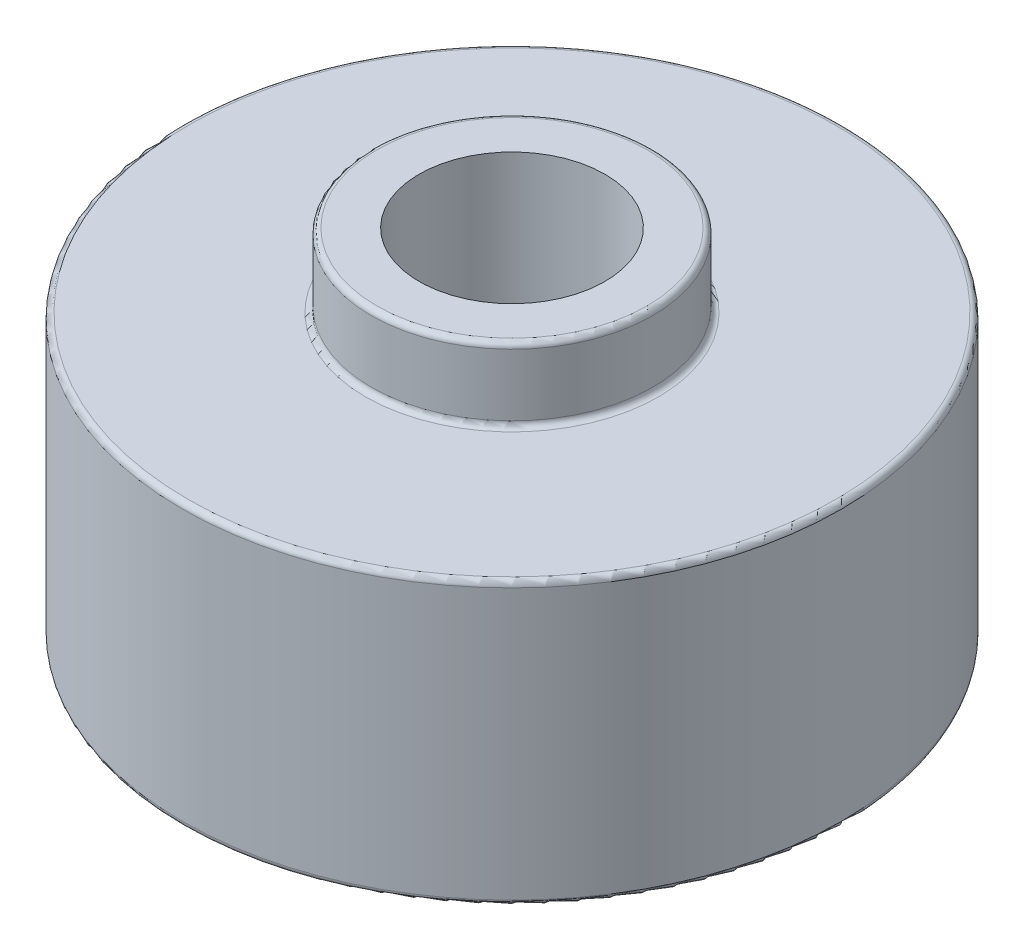
ISO-10303-21;
HEADER;
FILE_DESCRIPTION(('STEP AP214'),'2;1');
FILE_NAME('part.step','',(''),(''),'','','');
FILE_SCHEMA(('AUTOMOTIVE_DESIGN { 1 0 10303 214 1 1 1 1 }'));
ENDSEC;
DATA;
#1=APPLICATION_CONTEXT('core data for automotive mechanical design processes');
#2=APPLICATION_PROTOCOL_DEFINITION('international standard','automotive_design',2000,#1);
#3=PRODUCT_CONTEXT('',#1,'mechanical');
#4=PRODUCT('Part','Part','',(#3));
#5=PRODUCT_RELATED_PRODUCT_CATEGORY('part','',(#4));
#6=PRODUCT_DEFINITION_FORMATION('','',#4);
#7=PRODUCT_DEFINITION_CONTEXT('part definition',#1,'design');
#8=PRODUCT_DEFINITION('design','',#6,#7);
#9=PRODUCT_DEFINITION_SHAPE('','',#8);
#10=(LENGTH_UNIT() NAMED_UNIT(*) SI_UNIT(.MILLI.,.METRE.));
#11=(NAMED_UNIT(*) PLANE_ANGLE_UNIT() SI_UNIT($,.RADIAN.));
#12=(NAMED_UNIT(*) SI_UNIT($,.STERADIAN.) SOLID_ANGLE_UNIT());
#13=UNCERTAINTY_MEASURE_WITH_UNIT(LENGTH_MEASURE(1.E-05),#10,'distance_accuracy_value','');
#14=(GEOMETRIC_REPRESENTATION_CONTEXT(3) GLOBAL_UNCERTAINTY_ASSIGNED_CONTEXT((#13)) GLOBAL_UNIT_ASSIGNED_CONTEXT((#10,
#11,#12)) REPRESENTATION_CONTEXT('',''));
#15=CARTESIAN_POINT('',(0.,0.,0.));
#16=DIRECTION('',(0.,0.,1.));
#17=DIRECTION('',(1.,0.,0.));
#18=AXIS2_PLACEMENT_3D('',#15,#16,#17);
#19=CARTESIAN_POINT('',(6.35,0.,0.));
#20=DIRECTION('',(0.,-1.,0.));
#21=DIRECTION('',(0.,0.,-1.));
#22=AXIS2_PLACEMENT_3D('',#19,#20,#21);
#23=CYLINDRICAL_SURFACE('',#22,4.191);
#24=CARTESIAN_POINT('',(6.35,0.,0.));
#25=DIRECTION('',(0.,-1.,0.));
#26=DIRECTION('',(0.,0.,-1.));
#27=AXIS2_PLACEMENT_3D('',#24,#25,#26);
#28=CIRCLE('',#27,4.191);
#29=CARTESIAN_POINT('',(6.35,0.,-4.191));
#30=VERTEX_POINT('',#29);
#31=EDGE_CURVE('E68',#30,#30,#28,.T.);
#32=ORIENTED_EDGE('',*,*,#31,.T.);
#33=EDGE_LOOP('',(#32));
#34=FACE_BOUND('',#33,.T.);
#35=CARTESIAN_POINT('',(6.35,16.002,0.));
#36=DIRECTION('',(0.,-1.,0.));
#37=DIRECTION('',(0.,0.,-1.));
#38=AXIS2_PLACEMENT_3D('',#35,#36,#37);
#39=CIRCLE('',#38,4.191);
#40=CARTESIAN_POINT('',(6.35,16.002,-4.191));
#41=VERTEX_POINT('',#40);
#42=EDGE_CURVE('E65',#41,#41,#39,.T.);
#43=ORIENTED_EDGE('',*,*,#42,.F.);
#44=EDGE_LOOP('',(#43));
#45=FACE_BOUND('',#44,.T.);
#46=ADVANCED_FACE('F33',(#34,#45),#23,.F.);
#47=CARTESIAN_POINT('',(0.,16.002,0.));
#48=DIRECTION('',(0.,1.,0.));
#49=DIRECTION('',(0.,0.,1.));
#50=AXIS2_PLACEMENT_3D('',#47,#48,#49);
#51=PLANE('',#50);
#52=CARTESIAN_POINT('',(6.35,16.002,0.));
#53=DIRECTION('',(0.,1.,0.));
#54=DIRECTION('',(0.,0.,1.));
#55=AXIS2_PLACEMENT_3D('',#52,#53,#54);
#56=CIRCLE('',#55,6.096);
#57=CARTESIAN_POINT('',(6.35,16.002,6.096));
#58=VERTEX_POINT('',#57);
#59=EDGE_CURVE('E10',#58,#58,#56,.T.);
#60=ORIENTED_EDGE('',*,*,#59,.T.);
#61=EDGE_LOOP('',(#60));
#62=FACE_BOUND('',#61,.T.);
#63=ORIENTED_EDGE('',*,*,#42,.T.);
#64=EDGE_LOOP('',(#63));
#65=FACE_BOUND('',#64,.T.);
#66=ADVANCED_FACE('F91',(#62,#65),#51,.T.);
#67=CARTESIAN_POINT('',(6.35,0.,0.));
#68=DIRECTION('',(0.,-1.,0.));
#69=DIRECTION('',(0.,0.,-1.));
#70=AXIS2_PLACEMENT_3D('',#67,#68,#69);
#71=CYLINDRICAL_SURFACE('',#70,6.35);
#72=CARTESIAN_POINT('',(6.35,12.954,0.));
#73=DIRECTION('',(0.,1.,0.));
#74=DIRECTION('',(0.,0.,1.));
#75=AXIS2_PLACEMENT_3D('',#72,#73,#74);
#76=CIRCLE('',#75,6.35);
#77=CARTESIAN_POINT('',(6.35,12.954,6.35));
#78=VERTEX_POINT('',#77);
#79=EDGE_CURVE('E40',#78,#78,#76,.T.);
#80=ORIENTED_EDGE('',*,*,#79,.T.);
#81=EDGE_LOOP('',(#80));
#82=FACE_BOUND('',#81,.T.);
#83=CARTESIAN_POINT('',(6.35,15.748,0.));
#84=DIRECTION('',(0.,1.,0.));
#85=DIRECTION('',(0.,0.,1.));
#86=AXIS2_PLACEMENT_3D('',#83,#84,#85);
#87=CIRCLE('',#86,6.35);
#88=CARTESIAN_POINT('',(6.35,15.748,6.35));
#89=VERTEX_POINT('',#88);
#90=EDGE_CURVE('E44',#89,#89,#87,.F.);
#91=ORIENTED_EDGE('',*,*,#90,.T.);
#92=EDGE_LOOP('',(#91));
#93=FACE_BOUND('',#92,.T.);
#94=ADVANCED_FACE('F96',(#82,#93),#71,.T.);
#95=CARTESIAN_POINT('',(0.,12.7,0.));
#96=DIRECTION('',(0.,1.,0.));
#97=DIRECTION('',(0.,0.,1.));
#98=AXIS2_PLACEMENT_3D('',#95,#96,#97);
#99=PLANE('',#98);
#100=CARTESIAN_POINT('',(6.35,12.7,0.));
#101=DIRECTION('',(0.,1.,0.));
#102=DIRECTION('',(0.,0.,1.));
#103=AXIS2_PLACEMENT_3D('',#100,#101,#102);
#104=CIRCLE('',#103,14.605);
#105=CARTESIAN_POINT('',(6.35,12.7,14.605));
#106=VERTEX_POINT('',#105);
#107=EDGE_CURVE('E48',#106,#106,#104,.T.);
#108=ORIENTED_EDGE('',*,*,#107,.T.);
#109=EDGE_LOOP('',(#108));
#110=FACE_BOUND('',#109,.T.);
#111=CARTESIAN_POINT('',(6.35,12.7,0.));
#112=DIRECTION('',(0.,1.,0.));
#113=DIRECTION('',(0.,0.,1.));
#114=AXIS2_PLACEMENT_3D('',#111,#112,#113);
#115=CIRCLE('',#114,6.604);
#116=CARTESIAN_POINT('',(6.35,12.7,6.604));
#117=VERTEX_POINT('',#116);
#118=EDGE_CURVE('E53',#117,#117,#115,.F.);
#119=ORIENTED_EDGE('',*,*,#118,.T.);
#120=EDGE_LOOP('',(#119));
#121=FACE_BOUND('',#120,.T.);
#122=ADVANCED_FACE('F87',(#110,#121),#99,.T.);
#123=CARTESIAN_POINT('',(6.35,0.,0.));
#124=DIRECTION('',(0.,-1.,0.));
#125=DIRECTION('',(0.,0.,-1.));
#126=AXIS2_PLACEMENT_3D('',#123,#124,#125);
#127=CYLINDRICAL_SURFACE('',#126,14.859);
#128=CARTESIAN_POINT('',(6.35,0.254,0.));
#129=DIRECTION('',(0.,1.,0.));
#130=DIRECTION('',(0.,0.,1.));
#131=AXIS2_PLACEMENT_3D('',#128,#129,#130);
#132=CIRCLE('',#131,14.859);
#133=CARTESIAN_POINT('',(6.35,0.254,14.859));
#134=VERTEX_POINT('',#133);
#135=EDGE_CURVE('E56',#134,#134,#132,.T.);
#136=ORIENTED_EDGE('',*,*,#135,.T.);
#137=EDGE_LOOP('',(#136));
#138=FACE_BOUND('',#137,.T.);
#139=CARTESIAN_POINT('',(6.35,12.446,0.));
#140=DIRECTION('',(0.,1.,0.));
#141=DIRECTION('',(0.,0.,1.));
#142=AXIS2_PLACEMENT_3D('',#139,#140,#141);
#143=CIRCLE('',#142,14.859);
#144=CARTESIAN_POINT('',(6.35,12.446,14.859));
#145=VERTEX_POINT('',#144);
#146=EDGE_CURVE('E59',#145,#145,#143,.F.);
#147=ORIENTED_EDGE('',*,*,#146,.T.);
#148=EDGE_LOOP('',(#147));
#149=FACE_BOUND('',#148,.T.);
#150=ADVANCED_FACE('F77',(#138,#149),#127,.T.);
#151=CARTESIAN_POINT('',(0.,0.,0.));
#152=DIRECTION('',(0.,1.,0.));
#153=DIRECTION('',(0.,0.,1.));
#154=AXIS2_PLACEMENT_3D('',#151,#152,#153);
#155=PLANE('',#154);
#156=CARTESIAN_POINT('',(6.35,0.,0.));
#157=DIRECTION('',(0.,1.,0.));
#158=DIRECTION('',(0.,0.,1.));
#159=AXIS2_PLACEMENT_3D('',#156,#157,#158);
#160=CIRCLE('',#159,14.605);
#161=CARTESIAN_POINT('',(6.35,0.,14.605));
#162=VERTEX_POINT('',#161);
#163=EDGE_CURVE('E62',#162,#162,#160,.F.);
#164=ORIENTED_EDGE('',*,*,#163,.T.);
#165=EDGE_LOOP('',(#164));
#166=FACE_BOUND('',#165,.T.);
#167=ORIENTED_EDGE('',*,*,#31,.F.);
#168=EDGE_LOOP('',(#167));
#169=FACE_BOUND('',#168,.T.);
#170=ADVANCED_FACE('F74',(#166,#169),#155,.F.);
#171=CARTESIAN_POINT('',(6.35,0.254,0.));
#172=DIRECTION('',(0.,1.,0.));
#173=DIRECTION('',(0.,0.,1.));
#174=AXIS2_PLACEMENT_3D('',#171,#172,#173);
#175=TOROIDAL_SURFACE('',#174,14.605,0.254);
#176=ORIENTED_EDGE('',*,*,#135,.F.);
#177=EDGE_LOOP('',(#176));
#178=FACE_BOUND('',#177,.T.);
#179=ORIENTED_EDGE('',*,*,#163,.F.);
#180=EDGE_LOOP('',(#179));
#181=FACE_BOUND('',#180,.T.);
#182=ADVANCED_FACE('F76',(#178,#181),#175,.T.);
#183=CARTESIAN_POINT('',(6.35,12.446,0.));
#184=DIRECTION('',(0.,1.,0.));
#185=DIRECTION('',(0.,0.,1.));
#186=AXIS2_PLACEMENT_3D('',#183,#184,#185);
#187=TOROIDAL_SURFACE('',#186,14.605,0.254);
#188=ORIENTED_EDGE('',*,*,#107,.F.);
#189=EDGE_LOOP('',(#188));
#190=FACE_BOUND('',#189,.T.);
#191=ORIENTED_EDGE('',*,*,#146,.F.);
#192=EDGE_LOOP('',(#191));
#193=FACE_BOUND('',#192,.T.);
#194=ADVANCED_FACE('F84',(#190,#193),#187,.T.);
#195=CARTESIAN_POINT('',(6.35,12.954,0.));
#196=DIRECTION('',(0.,1.,0.));
#197=DIRECTION('',(0.,0.,1.));
#198=AXIS2_PLACEMENT_3D('',#195,#196,#197);
#199=TOROIDAL_SURFACE('',#198,6.604,0.254);
#200=ORIENTED_EDGE('',*,*,#79,.F.);
#201=EDGE_LOOP('',(#200));
#202=FACE_BOUND('',#201,.T.);
#203=ORIENTED_EDGE('',*,*,#118,.F.);
#204=EDGE_LOOP('',(#203));
#205=FACE_BOUND('',#204,.T.);
#206=ADVANCED_FACE('F101',(#202,#205),#199,.F.);
#207=CARTESIAN_POINT('',(6.35,15.748,0.));
#208=DIRECTION('',(0.,1.,0.));
#209=DIRECTION('',(0.,0.,1.));
#210=AXIS2_PLACEMENT_3D('',#207,#208,#209);
#211=TOROIDAL_SURFACE('',#210,6.096,0.254);
#212=ORIENTED_EDGE('',*,*,#59,.F.);
#213=EDGE_LOOP('',(#212));
#214=FACE_BOUND('',#213,.T.);
#215=ORIENTED_EDGE('',*,*,#90,.F.);
#216=EDGE_LOOP('',(#215));
#217=FACE_BOUND('',#216,.T.);
#218=ADVANCED_FACE('F35',(#214,#217),#211,.T.);
#219=CLOSED_SHELL('',(#46,#66,#94,#122,#150,#170,#182,#194,#206,#218));
#220=MANIFOLD_SOLID_BREP('B2',#219);
#221=ADVANCED_BREP_SHAPE_REPRESENTATION('',(#18,#220),#14);
#222=SHAPE_DEFINITION_REPRESENTATION(#9,#221);
ENDSEC;
END-ISO-10303-21;
